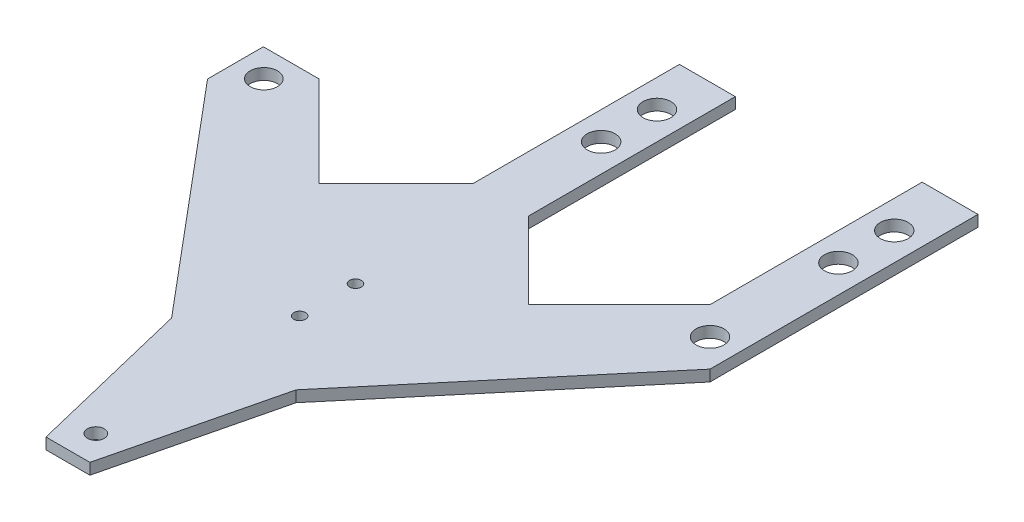
ISO-10303-21;
HEADER;
FILE_DESCRIPTION(('STEP AP214'),'2;1');
FILE_NAME('part.step','',(''),(''),'','','');
FILE_SCHEMA(('AUTOMOTIVE_DESIGN { 1 0 10303 214 1 1 1 1 }'));
ENDSEC;
DATA;
#1=APPLICATION_CONTEXT('core data for automotive mechanical design processes');
#2=APPLICATION_PROTOCOL_DEFINITION('international standard','automotive_design',2000,#1);
#3=PRODUCT_CONTEXT('',#1,'mechanical');
#4=PRODUCT('Part','Part','',(#3));
#5=PRODUCT_RELATED_PRODUCT_CATEGORY('part','',(#4));
#6=PRODUCT_DEFINITION_FORMATION('','',#4);
#7=PRODUCT_DEFINITION_CONTEXT('part definition',#1,'design');
#8=PRODUCT_DEFINITION('design','',#6,#7);
#9=PRODUCT_DEFINITION_SHAPE('','',#8);
#10=(LENGTH_UNIT() NAMED_UNIT(*) SI_UNIT(.MILLI.,.METRE.));
#11=(NAMED_UNIT(*) PLANE_ANGLE_UNIT() SI_UNIT($,.RADIAN.));
#12=(NAMED_UNIT(*) SI_UNIT($,.STERADIAN.) SOLID_ANGLE_UNIT());
#13=UNCERTAINTY_MEASURE_WITH_UNIT(LENGTH_MEASURE(1.E-05),#10,'distance_accuracy_value','');
#14=(GEOMETRIC_REPRESENTATION_CONTEXT(3) GLOBAL_UNCERTAINTY_ASSIGNED_CONTEXT((#13)) GLOBAL_UNIT_ASSIGNED_CONTEXT((#10,
#11,#12)) REPRESENTATION_CONTEXT('',''));
#15=CARTESIAN_POINT('',(0.,0.,0.));
#16=DIRECTION('',(0.,0.,1.));
#17=DIRECTION('',(1.,0.,0.));
#18=AXIS2_PLACEMENT_3D('',#15,#16,#17);
#19=CARTESIAN_POINT('',(0.,2.,0.));
#20=DIRECTION('',(0.,-1.,0.));
#21=DIRECTION('',(0.,0.,-1.));
#22=AXIS2_PLACEMENT_3D('',#19,#20,#21);
#23=PLANE('',#22);
#24=CARTESIAN_POINT('',(0.,2.,-16.5));
#25=DIRECTION('',(0.,1.,0.));
#26=DIRECTION('',(0.,0.,1.));
#27=AXIS2_PLACEMENT_3D('',#24,#25,#26);
#28=CIRCLE('',#27,1.05);
#29=CARTESIAN_POINT('',(0.,2.,-15.45));
#30=VERTEX_POINT('',#29);
#31=EDGE_CURVE('E356',#30,#30,#28,.T.);
#32=ORIENTED_EDGE('',*,*,#31,.F.);
#33=EDGE_LOOP('',(#32));
#34=FACE_BOUND('',#33,.T.);
#35=CARTESIAN_POINT('',(-0.00401466424763356,2.,-60.5));
#36=DIRECTION('',(0.,1.,0.));
#37=DIRECTION('',(0.,0.,1.));
#38=AXIS2_PLACEMENT_3D('',#35,#36,#37);
#39=CIRCLE('',#38,2.5);
#40=CARTESIAN_POINT('',(-0.00401466424763356,2.,-58.));
#41=VERTEX_POINT('',#40);
#42=EDGE_CURVE('E344',#41,#41,#39,.T.);
#43=ORIENTED_EDGE('',*,*,#42,.F.);
#44=EDGE_LOOP('',(#43));
#45=FACE_BOUND('',#44,.T.);
#46=CARTESIAN_POINT('',(40.,2.,-73.));
#47=DIRECTION('',(0.,1.,0.));
#48=DIRECTION('',(0.,0.,1.));
#49=AXIS2_PLACEMENT_3D('',#46,#47,#48);
#50=CIRCLE('',#49,2.5);
#51=CARTESIAN_POINT('',(40.,2.,-70.5));
#52=VERTEX_POINT('',#51);
#53=EDGE_CURVE('E332',#52,#52,#50,.T.);
#54=ORIENTED_EDGE('',*,*,#53,.F.);
#55=EDGE_LOOP('',(#54));
#56=FACE_BOUND('',#55,.T.);
#57=CARTESIAN_POINT('',(40.,2.,-40.));
#58=DIRECTION('',(0.,1.,0.));
#59=DIRECTION('',(0.,0.,1.));
#60=AXIS2_PLACEMENT_3D('',#57,#58,#59);
#61=CIRCLE('',#60,2.5);
#62=CARTESIAN_POINT('',(40.,2.,-37.5));
#63=VERTEX_POINT('',#62);
#64=EDGE_CURVE('E320',#63,#63,#61,.T.);
#65=ORIENTED_EDGE('',*,*,#64,.F.);
#66=EDGE_LOOP('',(#65));
#67=FACE_BOUND('',#66,.T.);
#68=DIRECTION('',(0.,0.,-1.));
#69=VECTOR('',#68,1.);
#70=CARTESIAN_POINT('',(45.,2.,-83.));
#71=LINE('',#70,#69);
#72=CARTESIAN_POINT('',(45.,2.,-35.));
#73=VERTEX_POINT('',#72);
#74=CARTESIAN_POINT('',(45.,2.,-83.));
#75=VERTEX_POINT('',#74);
#76=EDGE_CURVE('E52',#73,#75,#71,.T.);
#77=ORIENTED_EDGE('',*,*,#76,.T.);
#78=DIRECTION('',(-1.,0.,0.));
#79=VECTOR('',#78,1.);
#80=CARTESIAN_POINT('',(35.,2.,-83.));
#81=LINE('',#80,#79);
#82=CARTESIAN_POINT('',(35.,2.,-83.));
#83=VERTEX_POINT('',#82);
#84=EDGE_CURVE('E123',#75,#83,#81,.T.);
#85=ORIENTED_EDGE('',*,*,#84,.T.);
#86=DIRECTION('',(0.,0.,1.));
#87=VECTOR('',#86,1.);
#88=CARTESIAN_POINT('',(35.,2.,-45.));
#89=LINE('',#88,#87);
#90=CARTESIAN_POINT('',(35.,2.,-45.));
#91=VERTEX_POINT('',#90);
#92=EDGE_CURVE('E263',#83,#91,#89,.T.);
#93=ORIENTED_EDGE('',*,*,#92,.T.);
#94=DIRECTION('',(-0.707106781186541,0.,0.707106781186554));
#95=VECTOR('',#94,1.);
#96=CARTESIAN_POINT('',(35.,2.,-45.));
#97=LINE('',#96,#95);
#98=CARTESIAN_POINT('',(18.7500000000003,2.,-28.75));
#99=VERTEX_POINT('',#98);
#100=EDGE_CURVE('E283',#91,#99,#97,.T.);
#101=ORIENTED_EDGE('',*,*,#100,.T.);
#102=DIRECTION('',(-0.707106781186554,0.,-0.707106781186541));
#103=VECTOR('',#102,1.);
#104=CARTESIAN_POINT('',(5.,2.,-42.5));
#105=LINE('',#104,#103);
#106=CARTESIAN_POINT('',(5.,2.,-42.5));
#107=VERTEX_POINT('',#106);
#108=EDGE_CURVE('E280',#99,#107,#105,.T.);
#109=ORIENTED_EDGE('',*,*,#108,.T.);
#110=DIRECTION('',(0.,0.,-1.));
#111=VECTOR('',#110,1.);
#112=CARTESIAN_POINT('',(5.,2.,-79.5314750986378));
#113=LINE('',#112,#111);
#114=CARTESIAN_POINT('',(5.,2.,-79.5314750986378));
#115=VERTEX_POINT('',#114);
#116=EDGE_CURVE('E282',#107,#115,#113,.T.);
#117=ORIENTED_EDGE('',*,*,#116,.T.);
#118=DIRECTION('',(-1.,0.,0.));
#119=VECTOR('',#118,1.);
#120=CARTESIAN_POINT('',(-5.00401466424763,2.,-79.5314750986378));
#121=LINE('',#120,#119);
#122=CARTESIAN_POINT('',(-5.00401466424763,2.,-79.5314750986378));
#123=VERTEX_POINT('',#122);
#124=EDGE_CURVE('E285',#115,#123,#121,.T.);
#125=ORIENTED_EDGE('',*,*,#124,.T.);
#126=DIRECTION('',(0.,0.,1.));
#127=VECTOR('',#126,1.);
#128=CARTESIAN_POINT('',(-5.00401466424763,2.,-42.5));
#129=LINE('',#128,#127);
#130=CARTESIAN_POINT('',(-5.00401466424763,2.,-42.5));
#131=VERTEX_POINT('',#130);
#132=EDGE_CURVE('E291',#123,#131,#129,.T.);
#133=ORIENTED_EDGE('',*,*,#132,.T.);
#134=DIRECTION('',(-0.707003529621141,0.,0.707210017677386));
#135=VECTOR('',#134,1.);
#136=CARTESIAN_POINT('',(-18.7500000000003,2.,-28.75));
#137=LINE('',#136,#135);
#138=CARTESIAN_POINT('',(-18.7500000000003,2.,-28.75));
#139=VERTEX_POINT('',#138);
#140=EDGE_CURVE('E293',#131,#139,#137,.T.);
#141=ORIENTED_EDGE('',*,*,#140,.T.);
#142=DIRECTION('',(-0.707106781186541,0.,-0.707106781186554));
#143=VECTOR('',#142,1.);
#144=CARTESIAN_POINT('',(-35.,2.,-45.));
#145=LINE('',#144,#143);
#146=CARTESIAN_POINT('',(-35.,2.,-45.));
#147=VERTEX_POINT('',#146);
#148=EDGE_CURVE('E295',#139,#147,#145,.T.);
#149=ORIENTED_EDGE('',*,*,#148,.T.);
#150=DIRECTION('',(-1.,0.,0.));
#151=VECTOR('',#150,1.);
#152=CARTESIAN_POINT('',(-45.,2.,-45.));
#153=LINE('',#152,#151);
#154=CARTESIAN_POINT('',(-45.,2.,-45.));
#155=VERTEX_POINT('',#154);
#156=EDGE_CURVE('E297',#147,#155,#153,.T.);
#157=ORIENTED_EDGE('',*,*,#156,.T.);
#158=DIRECTION('',(0.,0.,1.));
#159=VECTOR('',#158,1.);
#160=CARTESIAN_POINT('',(-45.,2.,-45.));
#161=LINE('',#160,#159);
#162=CARTESIAN_POINT('',(-45.,2.,-35.));
#163=VERTEX_POINT('',#162);
#164=EDGE_CURVE('E299',#155,#163,#161,.T.);
#165=ORIENTED_EDGE('',*,*,#164,.T.);
#166=DIRECTION('',(0.643364883990594,0.,0.765559681571443));
#167=VECTOR('',#166,1.);
#168=CARTESIAN_POINT('',(-45.,2.,-35.));
#169=LINE('',#168,#167);
#170=CARTESIAN_POINT('',(-11.1498809278799,2.,5.27929876630725));
#171=VERTEX_POINT('',#170);
#172=EDGE_CURVE('E301',#163,#171,#169,.T.);
#173=ORIENTED_EDGE('',*,*,#172,.T.);
#174=DIRECTION('',(0.236030820361509,0.,0.971745569498247));
#175=VECTOR('',#174,1.);
#176=CARTESIAN_POINT('',(-11.1498809278799,2.,5.27929876630725));
#177=LINE('',#176,#175);
#178=CARTESIAN_POINT('',(-3.93091156583796,2.,35.));
#179=VERTEX_POINT('',#178);
#180=EDGE_CURVE('E170',#171,#179,#177,.T.);
#181=ORIENTED_EDGE('',*,*,#180,.T.);
#182=DIRECTION('',(1.,0.,0.));
#183=VECTOR('',#182,1.);
#184=CARTESIAN_POINT('',(3.93091156583796,2.,35.));
#185=LINE('',#184,#183);
#186=CARTESIAN_POINT('',(3.93091156583796,2.,35.));
#187=VERTEX_POINT('',#186);
#188=EDGE_CURVE('E164',#179,#187,#185,.T.);
#189=ORIENTED_EDGE('',*,*,#188,.T.);
#190=DIRECTION('',(0.236030820361509,0.,-0.971745569498247));
#191=VECTOR('',#190,1.);
#192=CARTESIAN_POINT('',(11.1498809278799,2.,5.27929876630725));
#193=LINE('',#192,#191);
#194=CARTESIAN_POINT('',(11.1498809278799,2.,5.27929876630725));
#195=VERTEX_POINT('',#194);
#196=EDGE_CURVE('E168',#187,#195,#193,.T.);
#197=ORIENTED_EDGE('',*,*,#196,.T.);
#198=DIRECTION('',(0.643364883990594,0.,-0.765559681571443));
#199=VECTOR('',#198,1.);
#200=CARTESIAN_POINT('',(45.,2.,-35.));
#201=LINE('',#200,#199);
#202=EDGE_CURVE('E184',#195,#73,#201,.T.);
#203=ORIENTED_EDGE('',*,*,#202,.T.);
#204=EDGE_LOOP('',(#77,#85,#93,#101,#109,#117,#125,#133,#141,#149,#157,#165,#173,#181,#189,#197,#203));
#205=FACE_BOUND('',#204,.T.);
#206=CARTESIAN_POINT('',(-39.999958797774,2.,-40.0811933154155));
#207=DIRECTION('',(0.,1.,0.));
#208=DIRECTION('',(0.,0.,1.));
#209=AXIS2_PLACEMENT_3D('',#206,#207,#208);
#210=CIRCLE('',#209,2.45281232916931);
#211=CARTESIAN_POINT('',(-39.999958797774,2.,-37.6283809862462));
#212=VERTEX_POINT('',#211);
#213=EDGE_CURVE('E193',#212,#212,#210,.T.);
#214=ORIENTED_EDGE('',*,*,#213,.F.);
#215=EDGE_LOOP('',(#214));
#216=FACE_BOUND('',#215,.T.);
#217=CARTESIAN_POINT('',(40.,2.,-63.));
#218=DIRECTION('',(0.,1.,0.));
#219=DIRECTION('',(0.,0.,1.));
#220=AXIS2_PLACEMENT_3D('',#217,#218,#219);
#221=CIRCLE('',#220,2.5);
#222=CARTESIAN_POINT('',(40.,2.,-60.5));
#223=VERTEX_POINT('',#222);
#224=EDGE_CURVE('E326',#223,#223,#221,.T.);
#225=ORIENTED_EDGE('',*,*,#224,.F.);
#226=EDGE_LOOP('',(#225));
#227=FACE_BOUND('',#226,.T.);
#228=CARTESIAN_POINT('',(0.,2.,-6.5));
#229=DIRECTION('',(0.,1.,0.));
#230=DIRECTION('',(0.,0.,1.));
#231=AXIS2_PLACEMENT_3D('',#228,#229,#230);
#232=CIRCLE('',#231,1.05);
#233=CARTESIAN_POINT('',(0.,2.,-5.45));
#234=VERTEX_POINT('',#233);
#235=EDGE_CURVE('E338',#234,#234,#232,.T.);
#236=ORIENTED_EDGE('',*,*,#235,.F.);
#237=EDGE_LOOP('',(#236));
#238=FACE_BOUND('',#237,.T.);
#239=CARTESIAN_POINT('',(0.,2.,-70.4999991941235));
#240=DIRECTION('',(0.,1.,0.));
#241=DIRECTION('',(0.,0.,1.));
#242=AXIS2_PLACEMENT_3D('',#239,#240,#241);
#243=CIRCLE('',#242,2.5);
#244=CARTESIAN_POINT('',(0.,2.,-67.9999991941235));
#245=VERTEX_POINT('',#244);
#246=EDGE_CURVE('E350',#245,#245,#243,.T.);
#247=ORIENTED_EDGE('',*,*,#246,.F.);
#248=EDGE_LOOP('',(#247));
#249=FACE_BOUND('',#248,.T.);
#250=CARTESIAN_POINT('',(0.,2.,30.));
#251=DIRECTION('',(0.,1.,0.));
#252=DIRECTION('',(0.,0.,1.));
#253=AXIS2_PLACEMENT_3D('',#250,#251,#252);
#254=CIRCLE('',#253,1.5);
#255=CARTESIAN_POINT('',(0.,2.,31.5));
#256=VERTEX_POINT('',#255);
#257=EDGE_CURVE('E362',#256,#256,#254,.T.);
#258=ORIENTED_EDGE('',*,*,#257,.F.);
#259=EDGE_LOOP('',(#258));
#260=FACE_BOUND('',#259,.T.);
#261=ADVANCED_FACE('F35',(#34,#45,#56,#67,#205,#216,#227,#238,#249,#260),#23,.F.);
#262=CARTESIAN_POINT('',(0.,0.,0.));
#263=DIRECTION('',(0.,-1.,0.));
#264=DIRECTION('',(0.,0.,-1.));
#265=AXIS2_PLACEMENT_3D('',#262,#263,#264);
#266=PLANE('',#265);
#267=CARTESIAN_POINT('',(0.,0.,-16.5));
#268=DIRECTION('',(0.,1.,0.));
#269=DIRECTION('',(0.,0.,1.));
#270=AXIS2_PLACEMENT_3D('',#267,#268,#269);
#271=CIRCLE('',#270,1.05);
#272=CARTESIAN_POINT('',(0.,0.,-15.45));
#273=VERTEX_POINT('',#272);
#274=EDGE_CURVE('E359',#273,#273,#271,.T.);
#275=ORIENTED_EDGE('',*,*,#274,.T.);
#276=EDGE_LOOP('',(#275));
#277=FACE_BOUND('',#276,.T.);
#278=CARTESIAN_POINT('',(-0.00401466424763356,0.,-60.5));
#279=DIRECTION('',(0.,1.,0.));
#280=DIRECTION('',(0.,0.,1.));
#281=AXIS2_PLACEMENT_3D('',#278,#279,#280);
#282=CIRCLE('',#281,2.5);
#283=CARTESIAN_POINT('',(-0.00401466424763356,0.,-58.));
#284=VERTEX_POINT('',#283);
#285=EDGE_CURVE('E347',#284,#284,#282,.T.);
#286=ORIENTED_EDGE('',*,*,#285,.T.);
#287=EDGE_LOOP('',(#286));
#288=FACE_BOUND('',#287,.T.);
#289=CARTESIAN_POINT('',(40.,0.,-73.));
#290=DIRECTION('',(0.,1.,0.));
#291=DIRECTION('',(0.,0.,1.));
#292=AXIS2_PLACEMENT_3D('',#289,#290,#291);
#293=CIRCLE('',#292,2.5);
#294=CARTESIAN_POINT('',(40.,0.,-70.5));
#295=VERTEX_POINT('',#294);
#296=EDGE_CURVE('E335',#295,#295,#293,.T.);
#297=ORIENTED_EDGE('',*,*,#296,.T.);
#298=EDGE_LOOP('',(#297));
#299=FACE_BOUND('',#298,.T.);
#300=CARTESIAN_POINT('',(40.,0.,-40.));
#301=DIRECTION('',(0.,1.,0.));
#302=DIRECTION('',(0.,0.,1.));
#303=AXIS2_PLACEMENT_3D('',#300,#301,#302);
#304=CIRCLE('',#303,2.5);
#305=CARTESIAN_POINT('',(40.,0.,-37.5));
#306=VERTEX_POINT('',#305);
#307=EDGE_CURVE('E323',#306,#306,#304,.T.);
#308=ORIENTED_EDGE('',*,*,#307,.T.);
#309=EDGE_LOOP('',(#308));
#310=FACE_BOUND('',#309,.T.);
#311=DIRECTION('',(-1.,0.,0.));
#312=VECTOR('',#311,1.);
#313=CARTESIAN_POINT('',(35.,0.,-83.));
#314=LINE('',#313,#312);
#315=CARTESIAN_POINT('',(45.,0.,-83.));
#316=VERTEX_POINT('',#315);
#317=CARTESIAN_POINT('',(35.,0.,-83.));
#318=VERTEX_POINT('',#317);
#319=EDGE_CURVE('E190',#316,#318,#314,.T.);
#320=ORIENTED_EDGE('',*,*,#319,.F.);
#321=DIRECTION('',(0.,0.,-1.));
#322=VECTOR('',#321,1.);
#323=CARTESIAN_POINT('',(45.,0.,-45.));
#324=LINE('',#323,#322);
#325=CARTESIAN_POINT('',(45.,0.,-35.));
#326=VERTEX_POINT('',#325);
#327=EDGE_CURVE('E220',#326,#316,#324,.T.);
#328=ORIENTED_EDGE('',*,*,#327,.F.);
#329=DIRECTION('',(0.643364883990594,0.,-0.765559681571443));
#330=VECTOR('',#329,1.);
#331=CARTESIAN_POINT('',(45.,0.,-35.));
#332=LINE('',#331,#330);
#333=CARTESIAN_POINT('',(11.1498809278799,0.,5.27929876630725));
#334=VERTEX_POINT('',#333);
#335=EDGE_CURVE('E116',#334,#326,#332,.T.);
#336=ORIENTED_EDGE('',*,*,#335,.F.);
#337=DIRECTION('',(0.236030820361509,0.,-0.971745569498247));
#338=VECTOR('',#337,1.);
#339=CARTESIAN_POINT('',(11.1498809278799,0.,5.27929876630725));
#340=LINE('',#339,#338);
#341=CARTESIAN_POINT('',(3.93091156583796,0.,35.));
#342=VERTEX_POINT('',#341);
#343=EDGE_CURVE('E109',#342,#334,#340,.T.);
#344=ORIENTED_EDGE('',*,*,#343,.F.);
#345=DIRECTION('',(1.,0.,0.));
#346=VECTOR('',#345,1.);
#347=CARTESIAN_POINT('',(3.93091156583796,0.,35.));
#348=LINE('',#347,#346);
#349=CARTESIAN_POINT('',(-3.93091156583796,0.,35.));
#350=VERTEX_POINT('',#349);
#351=EDGE_CURVE('E178',#350,#342,#348,.T.);
#352=ORIENTED_EDGE('',*,*,#351,.F.);
#353=DIRECTION('',(0.236030820361509,0.,0.971745569498247));
#354=VECTOR('',#353,1.);
#355=CARTESIAN_POINT('',(-11.1498809278799,0.,5.27929876630725));
#356=LINE('',#355,#354);
#357=CARTESIAN_POINT('',(-11.1498809278799,0.,5.27929876630725));
#358=VERTEX_POINT('',#357);
#359=EDGE_CURVE('E215',#358,#350,#356,.T.);
#360=ORIENTED_EDGE('',*,*,#359,.F.);
#361=DIRECTION('',(0.643364883990594,0.,0.765559681571443));
#362=VECTOR('',#361,1.);
#363=CARTESIAN_POINT('',(-45.,0.,-35.));
#364=LINE('',#363,#362);
#365=CARTESIAN_POINT('',(-45.,0.,-35.));
#366=VERTEX_POINT('',#365);
#367=EDGE_CURVE('E213',#366,#358,#364,.T.);
#368=ORIENTED_EDGE('',*,*,#367,.F.);
#369=DIRECTION('',(0.,0.,1.));
#370=VECTOR('',#369,1.);
#371=CARTESIAN_POINT('',(-45.,0.,-45.));
#372=LINE('',#371,#370);
#373=CARTESIAN_POINT('',(-45.,0.,-45.));
#374=VERTEX_POINT('',#373);
#375=EDGE_CURVE('E211',#374,#366,#372,.T.);
#376=ORIENTED_EDGE('',*,*,#375,.F.);
#377=DIRECTION('',(-1.,0.,0.));
#378=VECTOR('',#377,1.);
#379=CARTESIAN_POINT('',(-45.,0.,-45.));
#380=LINE('',#379,#378);
#381=CARTESIAN_POINT('',(-35.,0.,-45.));
#382=VERTEX_POINT('',#381);
#383=EDGE_CURVE('E209',#382,#374,#380,.T.);
#384=ORIENTED_EDGE('',*,*,#383,.F.);
#385=DIRECTION('',(-0.707106781186541,0.,-0.707106781186554));
#386=VECTOR('',#385,1.);
#387=CARTESIAN_POINT('',(-35.,0.,-45.));
#388=LINE('',#387,#386);
#389=CARTESIAN_POINT('',(-18.7500000000003,0.,-28.75));
#390=VERTEX_POINT('',#389);
#391=EDGE_CURVE('E207',#390,#382,#388,.T.);
#392=ORIENTED_EDGE('',*,*,#391,.F.);
#393=DIRECTION('',(-0.707003529621141,0.,0.707210017677386));
#394=VECTOR('',#393,1.);
#395=CARTESIAN_POINT('',(-18.7500000000003,0.,-28.75));
#396=LINE('',#395,#394);
#397=CARTESIAN_POINT('',(-5.00401466424763,0.,-42.5));
#398=VERTEX_POINT('',#397);
#399=EDGE_CURVE('E205',#398,#390,#396,.T.);
#400=ORIENTED_EDGE('',*,*,#399,.F.);
#401=DIRECTION('',(0.,0.,1.));
#402=VECTOR('',#401,1.);
#403=CARTESIAN_POINT('',(-5.00401466424763,0.,-42.5));
#404=LINE('',#403,#402);
#405=CARTESIAN_POINT('',(-5.00401466424763,0.,-79.5314750986378));
#406=VERTEX_POINT('',#405);
#407=EDGE_CURVE('E203',#406,#398,#404,.T.);
#408=ORIENTED_EDGE('',*,*,#407,.F.);
#409=DIRECTION('',(-1.,0.,0.));
#410=VECTOR('',#409,1.);
#411=CARTESIAN_POINT('',(-5.00401466424763,0.,-79.5314750986378));
#412=LINE('',#411,#410);
#413=CARTESIAN_POINT('',(5.,0.,-79.5314750986378));
#414=VERTEX_POINT('',#413);
#415=EDGE_CURVE('E201',#414,#406,#412,.T.);
#416=ORIENTED_EDGE('',*,*,#415,.F.);
#417=DIRECTION('',(0.,0.,-1.));
#418=VECTOR('',#417,1.);
#419=CARTESIAN_POINT('',(5.,0.,-79.5314750986378));
#420=LINE('',#419,#418);
#421=CARTESIAN_POINT('',(5.,0.,-42.5));
#422=VERTEX_POINT('',#421);
#423=EDGE_CURVE('E199',#422,#414,#420,.T.);
#424=ORIENTED_EDGE('',*,*,#423,.F.);
#425=DIRECTION('',(-0.707106781186554,0.,-0.707106781186541));
#426=VECTOR('',#425,1.);
#427=CARTESIAN_POINT('',(5.,0.,-42.5));
#428=LINE('',#427,#426);
#429=CARTESIAN_POINT('',(18.7500000000003,0.,-28.75));
#430=VERTEX_POINT('',#429);
#431=EDGE_CURVE('E197',#430,#422,#428,.T.);
#432=ORIENTED_EDGE('',*,*,#431,.F.);
#433=DIRECTION('',(-0.707106781186541,0.,0.707106781186554));
#434=VECTOR('',#433,1.);
#435=CARTESIAN_POINT('',(35.,0.,-45.));
#436=LINE('',#435,#434);
#437=CARTESIAN_POINT('',(35.,0.,-45.));
#438=VERTEX_POINT('',#437);
#439=EDGE_CURVE('E195',#438,#430,#436,.T.);
#440=ORIENTED_EDGE('',*,*,#439,.F.);
#441=DIRECTION('',(0.,0.,1.));
#442=VECTOR('',#441,1.);
#443=CARTESIAN_POINT('',(35.,0.,-45.));
#444=LINE('',#443,#442);
#445=EDGE_CURVE('E192',#318,#438,#444,.T.);
#446=ORIENTED_EDGE('',*,*,#445,.F.);
#447=EDGE_LOOP('',(#320,#328,#336,#344,#352,#360,#368,#376,#384,#392,#400,#408,#416,#424,#432,
#440,#446));
#448=FACE_BOUND('',#447,.T.);
#449=CARTESIAN_POINT('',(-39.999958797774,0.,-40.0811933154155));
#450=DIRECTION('',(0.,1.,0.));
#451=DIRECTION('',(0.,0.,1.));
#452=AXIS2_PLACEMENT_3D('',#449,#450,#451);
#453=CIRCLE('',#452,2.45281232916931);
#454=CARTESIAN_POINT('',(-39.999958797774,0.,-37.6283809862462));
#455=VERTEX_POINT('',#454);
#456=EDGE_CURVE('E317',#455,#455,#453,.T.);
#457=ORIENTED_EDGE('',*,*,#456,.T.);
#458=EDGE_LOOP('',(#457));
#459=FACE_BOUND('',#458,.T.);
#460=CARTESIAN_POINT('',(40.,0.,-63.));
#461=DIRECTION('',(0.,1.,0.));
#462=DIRECTION('',(0.,0.,1.));
#463=AXIS2_PLACEMENT_3D('',#460,#461,#462);
#464=CIRCLE('',#463,2.5);
#465=CARTESIAN_POINT('',(40.,0.,-60.5));
#466=VERTEX_POINT('',#465);
#467=EDGE_CURVE('E329',#466,#466,#464,.T.);
#468=ORIENTED_EDGE('',*,*,#467,.T.);
#469=EDGE_LOOP('',(#468));
#470=FACE_BOUND('',#469,.T.);
#471=CARTESIAN_POINT('',(0.,0.,-6.5));
#472=DIRECTION('',(0.,1.,0.));
#473=DIRECTION('',(0.,0.,1.));
#474=AXIS2_PLACEMENT_3D('',#471,#472,#473);
#475=CIRCLE('',#474,1.05);
#476=CARTESIAN_POINT('',(0.,0.,-5.45));
#477=VERTEX_POINT('',#476);
#478=EDGE_CURVE('E341',#477,#477,#475,.T.);
#479=ORIENTED_EDGE('',*,*,#478,.T.);
#480=EDGE_LOOP('',(#479));
#481=FACE_BOUND('',#480,.T.);
#482=CARTESIAN_POINT('',(0.,0.,-70.4999991941235));
#483=DIRECTION('',(0.,1.,0.));
#484=DIRECTION('',(0.,0.,1.));
#485=AXIS2_PLACEMENT_3D('',#482,#483,#484);
#486=CIRCLE('',#485,2.5);
#487=CARTESIAN_POINT('',(0.,0.,-67.9999991941235));
#488=VERTEX_POINT('',#487);
#489=EDGE_CURVE('E353',#488,#488,#486,.T.);
#490=ORIENTED_EDGE('',*,*,#489,.T.);
#491=EDGE_LOOP('',(#490));
#492=FACE_BOUND('',#491,.T.);
#493=CARTESIAN_POINT('',(0.,0.,30.));
#494=DIRECTION('',(0.,1.,0.));
#495=DIRECTION('',(0.,0.,1.));
#496=AXIS2_PLACEMENT_3D('',#493,#494,#495);
#497=CIRCLE('',#496,1.5);
#498=CARTESIAN_POINT('',(0.,0.,31.5));
#499=VERTEX_POINT('',#498);
#500=EDGE_CURVE('E365',#499,#499,#497,.T.);
#501=ORIENTED_EDGE('',*,*,#500,.T.);
#502=EDGE_LOOP('',(#501));
#503=FACE_BOUND('',#502,.T.);
#504=ADVANCED_FACE('F267',(#277,#288,#299,#310,#448,#459,#470,#481,#492,#503),#266,.T.);
#505=CARTESIAN_POINT('',(35.,2.,-83.));
#506=DIRECTION('',(0.,0.,1.));
#507=DIRECTION('',(1.,0.,0.));
#508=AXIS2_PLACEMENT_3D('',#505,#506,#507);
#509=PLANE('',#508);
#510=ORIENTED_EDGE('',*,*,#319,.T.);
#511=DIRECTION('',(0.,-1.,0.));
#512=VECTOR('',#511,1.);
#513=CARTESIAN_POINT('',(35.,2.,-83.));
#514=LINE('',#513,#512);
#515=EDGE_CURVE('E44',#83,#318,#514,.T.);
#516=ORIENTED_EDGE('',*,*,#515,.F.);
#517=ORIENTED_EDGE('',*,*,#84,.F.);
#518=DIRECTION('',(0.,-1.,0.));
#519=VECTOR('',#518,1.);
#520=CARTESIAN_POINT('',(45.,2.,-83.));
#521=LINE('',#520,#519);
#522=EDGE_CURVE('E11',#75,#316,#521,.T.);
#523=ORIENTED_EDGE('',*,*,#522,.T.);
#524=EDGE_LOOP('',(#510,#516,#517,#523));
#525=FACE_BOUND('',#524,.T.);
#526=ADVANCED_FACE('F37',(#525),#509,.F.);
#527=CARTESIAN_POINT('',(35.,2.,-45.));
#528=DIRECTION('',(1.,0.,0.));
#529=DIRECTION('',(0.,0.,-1.));
#530=AXIS2_PLACEMENT_3D('',#527,#528,#529);
#531=PLANE('',#530);
#532=ORIENTED_EDGE('',*,*,#445,.T.);
#533=DIRECTION('',(0.,-1.,0.));
#534=VECTOR('',#533,1.);
#535=CARTESIAN_POINT('',(35.,2.,-45.));
#536=LINE('',#535,#534);
#537=EDGE_CURVE('E255',#91,#438,#536,.T.);
#538=ORIENTED_EDGE('',*,*,#537,.F.);
#539=ORIENTED_EDGE('',*,*,#92,.F.);
#540=ORIENTED_EDGE('',*,*,#515,.T.);
#541=EDGE_LOOP('',(#532,#538,#539,#540));
#542=FACE_BOUND('',#541,.T.);
#543=ADVANCED_FACE('F261',(#542),#531,.F.);
#544=CARTESIAN_POINT('',(35.,2.,-45.));
#545=DIRECTION('',(0.707106781186554,0.,0.707106781186541));
#546=DIRECTION('',(0.707106781186541,0.,-0.707106781186554));
#547=AXIS2_PLACEMENT_3D('',#544,#545,#546);
#548=PLANE('',#547);
#549=ORIENTED_EDGE('',*,*,#439,.T.);
#550=DIRECTION('',(0.,-1.,0.));
#551=VECTOR('',#550,1.);
#552=CARTESIAN_POINT('',(18.7500000000003,2.,-28.75));
#553=LINE('',#552,#551);
#554=EDGE_CURVE('E252',#99,#430,#553,.T.);
#555=ORIENTED_EDGE('',*,*,#554,.F.);
#556=ORIENTED_EDGE('',*,*,#100,.F.);
#557=ORIENTED_EDGE('',*,*,#537,.T.);
#558=EDGE_LOOP('',(#549,#555,#556,#557));
#559=FACE_BOUND('',#558,.T.);
#560=ADVANCED_FACE('F274',(#559),#548,.F.);
#561=CARTESIAN_POINT('',(5.,2.,-42.5));
#562=DIRECTION('',(-0.707106781186541,0.,0.707106781186554));
#563=DIRECTION('',(0.707106781186554,0.,0.707106781186541));
#564=AXIS2_PLACEMENT_3D('',#561,#562,#563);
#565=PLANE('',#564);
#566=ORIENTED_EDGE('',*,*,#431,.T.);
#567=DIRECTION('',(0.,-1.,0.));
#568=VECTOR('',#567,1.);
#569=CARTESIAN_POINT('',(5.,2.,-42.5));
#570=LINE('',#569,#568);
#571=EDGE_CURVE('E249',#107,#422,#570,.T.);
#572=ORIENTED_EDGE('',*,*,#571,.F.);
#573=ORIENTED_EDGE('',*,*,#108,.F.);
#574=ORIENTED_EDGE('',*,*,#554,.T.);
#575=EDGE_LOOP('',(#566,#572,#573,#574));
#576=FACE_BOUND('',#575,.T.);
#577=ADVANCED_FACE('F278',(#576),#565,.F.);
#578=CARTESIAN_POINT('',(5.,2.,-79.5314750986378));
#579=DIRECTION('',(-1.,0.,0.));
#580=DIRECTION('',(0.,0.,1.));
#581=AXIS2_PLACEMENT_3D('',#578,#579,#580);
#582=PLANE('',#581);
#583=ORIENTED_EDGE('',*,*,#423,.T.);
#584=DIRECTION('',(0.,-1.,0.));
#585=VECTOR('',#584,1.);
#586=CARTESIAN_POINT('',(5.,2.,-79.5314750986378));
#587=LINE('',#586,#585);
#588=EDGE_CURVE('E246',#115,#414,#587,.T.);
#589=ORIENTED_EDGE('',*,*,#588,.F.);
#590=ORIENTED_EDGE('',*,*,#116,.F.);
#591=ORIENTED_EDGE('',*,*,#571,.T.);
#592=EDGE_LOOP('',(#583,#589,#590,#591));
#593=FACE_BOUND('',#592,.T.);
#594=ADVANCED_FACE('F423',(#593),#582,.F.);
#595=CARTESIAN_POINT('',(-5.00401466424763,2.,-79.5314750986378));
#596=DIRECTION('',(0.,0.,1.));
#597=DIRECTION('',(1.,0.,0.));
#598=AXIS2_PLACEMENT_3D('',#595,#596,#597);
#599=PLANE('',#598);
#600=ORIENTED_EDGE('',*,*,#415,.T.);
#601=DIRECTION('',(0.,-1.,0.));
#602=VECTOR('',#601,1.);
#603=CARTESIAN_POINT('',(-5.00401466424763,2.,-79.5314750986378));
#604=LINE('',#603,#602);
#605=EDGE_CURVE('E243',#123,#406,#604,.T.);
#606=ORIENTED_EDGE('',*,*,#605,.F.);
#607=ORIENTED_EDGE('',*,*,#124,.F.);
#608=ORIENTED_EDGE('',*,*,#588,.T.);
#609=EDGE_LOOP('',(#600,#606,#607,#608));
#610=FACE_BOUND('',#609,.T.);
#611=ADVANCED_FACE('F419',(#610),#599,.F.);
#612=CARTESIAN_POINT('',(-5.00401466424763,2.,-42.5));
#613=DIRECTION('',(1.,0.,0.));
#614=DIRECTION('',(0.,0.,-1.));
#615=AXIS2_PLACEMENT_3D('',#612,#613,#614);
#616=PLANE('',#615);
#617=ORIENTED_EDGE('',*,*,#407,.T.);
#618=DIRECTION('',(0.,-1.,0.));
#619=VECTOR('',#618,1.);
#620=CARTESIAN_POINT('',(-5.00401466424763,2.,-42.5));
#621=LINE('',#620,#619);
#622=EDGE_CURVE('E240',#131,#398,#621,.T.);
#623=ORIENTED_EDGE('',*,*,#622,.F.);
#624=ORIENTED_EDGE('',*,*,#132,.F.);
#625=ORIENTED_EDGE('',*,*,#605,.T.);
#626=EDGE_LOOP('',(#617,#623,#624,#625));
#627=FACE_BOUND('',#626,.T.);
#628=ADVANCED_FACE('F415',(#627),#616,.F.);
#629=CARTESIAN_POINT('',(-18.7500000000003,2.,-28.75));
#630=DIRECTION('',(0.707210017677386,0.,0.707003529621141));
#631=DIRECTION('',(0.707003529621141,0.,-0.707210017677386));
#632=AXIS2_PLACEMENT_3D('',#629,#630,#631);
#633=PLANE('',#632);
#634=ORIENTED_EDGE('',*,*,#399,.T.);
#635=DIRECTION('',(0.,-1.,0.));
#636=VECTOR('',#635,1.);
#637=CARTESIAN_POINT('',(-18.7500000000003,2.,-28.75));
#638=LINE('',#637,#636);
#639=EDGE_CURVE('E237',#139,#390,#638,.T.);
#640=ORIENTED_EDGE('',*,*,#639,.F.);
#641=ORIENTED_EDGE('',*,*,#140,.F.);
#642=ORIENTED_EDGE('',*,*,#622,.T.);
#643=EDGE_LOOP('',(#634,#640,#641,#642));
#644=FACE_BOUND('',#643,.T.);
#645=ADVANCED_FACE('F411',(#644),#633,.F.);
#646=CARTESIAN_POINT('',(-35.,2.,-45.));
#647=DIRECTION('',(-0.707106781186554,0.,0.707106781186541));
#648=DIRECTION('',(0.707106781186541,0.,0.707106781186554));
#649=AXIS2_PLACEMENT_3D('',#646,#647,#648);
#650=PLANE('',#649);
#651=ORIENTED_EDGE('',*,*,#391,.T.);
#652=DIRECTION('',(0.,-1.,0.));
#653=VECTOR('',#652,1.);
#654=CARTESIAN_POINT('',(-35.,2.,-45.));
#655=LINE('',#654,#653);
#656=EDGE_CURVE('E234',#147,#382,#655,.T.);
#657=ORIENTED_EDGE('',*,*,#656,.F.);
#658=ORIENTED_EDGE('',*,*,#148,.F.);
#659=ORIENTED_EDGE('',*,*,#639,.T.);
#660=EDGE_LOOP('',(#651,#657,#658,#659));
#661=FACE_BOUND('',#660,.T.);
#662=ADVANCED_FACE('F407',(#661),#650,.F.);
#663=CARTESIAN_POINT('',(-45.,2.,-45.));
#664=DIRECTION('',(0.,0.,1.));
#665=DIRECTION('',(1.,0.,0.));
#666=AXIS2_PLACEMENT_3D('',#663,#664,#665);
#667=PLANE('',#666);
#668=ORIENTED_EDGE('',*,*,#383,.T.);
#669=DIRECTION('',(0.,-1.,0.));
#670=VECTOR('',#669,1.);
#671=CARTESIAN_POINT('',(-45.,2.,-45.));
#672=LINE('',#671,#670);
#673=EDGE_CURVE('E231',#155,#374,#672,.T.);
#674=ORIENTED_EDGE('',*,*,#673,.F.);
#675=ORIENTED_EDGE('',*,*,#156,.F.);
#676=ORIENTED_EDGE('',*,*,#656,.T.);
#677=EDGE_LOOP('',(#668,#674,#675,#676));
#678=FACE_BOUND('',#677,.T.);
#679=ADVANCED_FACE('F403',(#678),#667,.F.);
#680=CARTESIAN_POINT('',(-45.,2.,-45.));
#681=DIRECTION('',(1.,0.,0.));
#682=DIRECTION('',(0.,0.,-1.));
#683=AXIS2_PLACEMENT_3D('',#680,#681,#682);
#684=PLANE('',#683);
#685=ORIENTED_EDGE('',*,*,#375,.T.);
#686=DIRECTION('',(0.,-1.,0.));
#687=VECTOR('',#686,1.);
#688=CARTESIAN_POINT('',(-45.,2.,-35.));
#689=LINE('',#688,#687);
#690=EDGE_CURVE('E228',#163,#366,#689,.T.);
#691=ORIENTED_EDGE('',*,*,#690,.F.);
#692=ORIENTED_EDGE('',*,*,#164,.F.);
#693=ORIENTED_EDGE('',*,*,#673,.T.);
#694=EDGE_LOOP('',(#685,#691,#692,#693));
#695=FACE_BOUND('',#694,.T.);
#696=ADVANCED_FACE('F400',(#695),#684,.F.);
#697=CARTESIAN_POINT('',(-45.,2.,-35.));
#698=DIRECTION('',(0.765559681571443,0.,-0.643364883990594));
#699=DIRECTION('',(-0.643364883990594,0.,-0.765559681571443));
#700=AXIS2_PLACEMENT_3D('',#697,#698,#699);
#701=PLANE('',#700);
#702=ORIENTED_EDGE('',*,*,#367,.T.);
#703=DIRECTION('',(0.,-1.,0.));
#704=VECTOR('',#703,1.);
#705=CARTESIAN_POINT('',(-11.1498809278799,2.,5.27929876630725));
#706=LINE('',#705,#704);
#707=EDGE_CURVE('E225',#171,#358,#706,.T.);
#708=ORIENTED_EDGE('',*,*,#707,.F.);
#709=ORIENTED_EDGE('',*,*,#172,.F.);
#710=ORIENTED_EDGE('',*,*,#690,.T.);
#711=EDGE_LOOP('',(#702,#708,#709,#710));
#712=FACE_BOUND('',#711,.T.);
#713=ADVANCED_FACE('F307',(#712),#701,.F.);
#714=CARTESIAN_POINT('',(-11.1498809278799,2.,5.27929876630725));
#715=DIRECTION('',(0.971745569498247,0.,-0.236030820361509));
#716=DIRECTION('',(-0.236030820361509,0.,-0.971745569498247));
#717=AXIS2_PLACEMENT_3D('',#714,#715,#716);
#718=PLANE('',#717);
#719=ORIENTED_EDGE('',*,*,#359,.T.);
#720=DIRECTION('',(0.,-1.,0.));
#721=VECTOR('',#720,1.);
#722=CARTESIAN_POINT('',(-3.93091156583796,2.,35.));
#723=LINE('',#722,#721);
#724=EDGE_CURVE('E179',#179,#350,#723,.T.);
#725=ORIENTED_EDGE('',*,*,#724,.F.);
#726=ORIENTED_EDGE('',*,*,#180,.F.);
#727=ORIENTED_EDGE('',*,*,#707,.T.);
#728=EDGE_LOOP('',(#719,#725,#726,#727));
#729=FACE_BOUND('',#728,.T.);
#730=ADVANCED_FACE('F311',(#729),#718,.F.);
#731=CARTESIAN_POINT('',(3.93091156583796,2.,35.));
#732=DIRECTION('',(0.,0.,-1.));
#733=DIRECTION('',(-1.,0.,0.));
#734=AXIS2_PLACEMENT_3D('',#731,#732,#733);
#735=PLANE('',#734);
#736=ORIENTED_EDGE('',*,*,#351,.T.);
#737=DIRECTION('',(0.,-1.,0.));
#738=VECTOR('',#737,1.);
#739=CARTESIAN_POINT('',(3.93091156583796,2.,35.));
#740=LINE('',#739,#738);
#741=EDGE_CURVE('E175',#187,#342,#740,.T.);
#742=ORIENTED_EDGE('',*,*,#741,.F.);
#743=ORIENTED_EDGE('',*,*,#188,.F.);
#744=ORIENTED_EDGE('',*,*,#724,.T.);
#745=EDGE_LOOP('',(#736,#742,#743,#744));
#746=FACE_BOUND('',#745,.T.);
#747=ADVANCED_FACE('F176',(#746),#735,.F.);
#748=CARTESIAN_POINT('',(11.1498809278799,2.,5.27929876630725));
#749=DIRECTION('',(-0.971745569498247,0.,-0.236030820361509));
#750=DIRECTION('',(-0.236030820361509,0.,0.971745569498247));
#751=AXIS2_PLACEMENT_3D('',#748,#749,#750);
#752=PLANE('',#751);
#753=ORIENTED_EDGE('',*,*,#343,.T.);
#754=DIRECTION('',(0.,-1.,0.));
#755=VECTOR('',#754,1.);
#756=CARTESIAN_POINT('',(11.1498809278799,2.,5.27929876630725));
#757=LINE('',#756,#755);
#758=EDGE_CURVE('E180',#195,#334,#757,.T.);
#759=ORIENTED_EDGE('',*,*,#758,.F.);
#760=ORIENTED_EDGE('',*,*,#196,.F.);
#761=ORIENTED_EDGE('',*,*,#741,.T.);
#762=EDGE_LOOP('',(#753,#759,#760,#761));
#763=FACE_BOUND('',#762,.T.);
#764=ADVANCED_FACE('F182',(#763),#752,.F.);
#765=CARTESIAN_POINT('',(45.,2.,-35.));
#766=DIRECTION('',(-0.765559681571443,0.,-0.643364883990594));
#767=DIRECTION('',(-0.643364883990594,0.,0.765559681571443));
#768=AXIS2_PLACEMENT_3D('',#765,#766,#767);
#769=PLANE('',#768);
#770=ORIENTED_EDGE('',*,*,#335,.T.);
#771=DIRECTION('',(0.,-1.,0.));
#772=VECTOR('',#771,1.);
#773=CARTESIAN_POINT('',(45.,2.,-35.));
#774=LINE('',#773,#772);
#775=EDGE_CURVE('E186',#73,#326,#774,.T.);
#776=ORIENTED_EDGE('',*,*,#775,.F.);
#777=ORIENTED_EDGE('',*,*,#202,.F.);
#778=ORIENTED_EDGE('',*,*,#758,.T.);
#779=EDGE_LOOP('',(#770,#776,#777,#778));
#780=FACE_BOUND('',#779,.T.);
#781=ADVANCED_FACE('F313',(#780),#769,.F.);
#782=CARTESIAN_POINT('',(45.,2.,-45.));
#783=DIRECTION('',(-1.,0.,0.));
#784=DIRECTION('',(0.,0.,1.));
#785=AXIS2_PLACEMENT_3D('',#782,#783,#784);
#786=PLANE('',#785);
#787=ORIENTED_EDGE('',*,*,#327,.T.);
#788=ORIENTED_EDGE('',*,*,#522,.F.);
#789=ORIENTED_EDGE('',*,*,#76,.F.);
#790=ORIENTED_EDGE('',*,*,#775,.T.);
#791=EDGE_LOOP('',(#787,#788,#789,#790));
#792=FACE_BOUND('',#791,.T.);
#793=ADVANCED_FACE('F312',(#792),#786,.F.);
#794=CARTESIAN_POINT('',(-39.999958797774,2.,-40.0811933154155));
#795=DIRECTION('',(0.,-1.,0.));
#796=DIRECTION('',(0.,0.,-1.));
#797=AXIS2_PLACEMENT_3D('',#794,#795,#796);
#798=CYLINDRICAL_SURFACE('',#797,2.45281232916931);
#799=ORIENTED_EDGE('',*,*,#213,.T.);
#800=EDGE_LOOP('',(#799));
#801=FACE_BOUND('',#800,.T.);
#802=ORIENTED_EDGE('',*,*,#456,.F.);
#803=EDGE_LOOP('',(#802));
#804=FACE_BOUND('',#803,.T.);
#805=ADVANCED_FACE('F385',(#801,#804),#798,.F.);
#806=CARTESIAN_POINT('',(40.,2.,-40.));
#807=DIRECTION('',(0.,-1.,0.));
#808=DIRECTION('',(0.,0.,-1.));
#809=AXIS2_PLACEMENT_3D('',#806,#807,#808);
#810=CYLINDRICAL_SURFACE('',#809,2.5);
#811=ORIENTED_EDGE('',*,*,#64,.T.);
#812=EDGE_LOOP('',(#811));
#813=FACE_BOUND('',#812,.T.);
#814=ORIENTED_EDGE('',*,*,#307,.F.);
#815=EDGE_LOOP('',(#814));
#816=FACE_BOUND('',#815,.T.);
#817=ADVANCED_FACE('F539',(#813,#816),#810,.F.);
#818=CARTESIAN_POINT('',(40.,2.,-63.));
#819=DIRECTION('',(0.,-1.,0.));
#820=DIRECTION('',(0.,0.,-1.));
#821=AXIS2_PLACEMENT_3D('',#818,#819,#820);
#822=CYLINDRICAL_SURFACE('',#821,2.5);
#823=ORIENTED_EDGE('',*,*,#224,.T.);
#824=EDGE_LOOP('',(#823));
#825=FACE_BOUND('',#824,.T.);
#826=ORIENTED_EDGE('',*,*,#467,.F.);
#827=EDGE_LOOP('',(#826));
#828=FACE_BOUND('',#827,.T.);
#829=ADVANCED_FACE('F547',(#825,#828),#822,.F.);
#830=CARTESIAN_POINT('',(40.,2.,-73.));
#831=DIRECTION('',(0.,-1.,0.));
#832=DIRECTION('',(0.,0.,-1.));
#833=AXIS2_PLACEMENT_3D('',#830,#831,#832);
#834=CYLINDRICAL_SURFACE('',#833,2.5);
#835=ORIENTED_EDGE('',*,*,#53,.T.);
#836=EDGE_LOOP('',(#835));
#837=FACE_BOUND('',#836,.T.);
#838=ORIENTED_EDGE('',*,*,#296,.F.);
#839=EDGE_LOOP('',(#838));
#840=FACE_BOUND('',#839,.T.);
#841=ADVANCED_FACE('F555',(#837,#840),#834,.F.);
#842=CARTESIAN_POINT('',(0.,2.,-6.5));
#843=DIRECTION('',(0.,-1.,0.));
#844=DIRECTION('',(0.,0.,-1.));
#845=AXIS2_PLACEMENT_3D('',#842,#843,#844);
#846=CYLINDRICAL_SURFACE('',#845,1.05);
#847=ORIENTED_EDGE('',*,*,#235,.T.);
#848=EDGE_LOOP('',(#847));
#849=FACE_BOUND('',#848,.T.);
#850=ORIENTED_EDGE('',*,*,#478,.F.);
#851=EDGE_LOOP('',(#850));
#852=FACE_BOUND('',#851,.T.);
#853=ADVANCED_FACE('F564',(#849,#852),#846,.F.);
#854=CARTESIAN_POINT('',(-0.00401466424763356,2.,-60.5));
#855=DIRECTION('',(0.,-1.,0.));
#856=DIRECTION('',(0.,0.,-1.));
#857=AXIS2_PLACEMENT_3D('',#854,#855,#856);
#858=CYLINDRICAL_SURFACE('',#857,2.5);
#859=ORIENTED_EDGE('',*,*,#42,.T.);
#860=EDGE_LOOP('',(#859));
#861=FACE_BOUND('',#860,.T.);
#862=ORIENTED_EDGE('',*,*,#285,.F.);
#863=EDGE_LOOP('',(#862));
#864=FACE_BOUND('',#863,.T.);
#865=ADVANCED_FACE('F573',(#861,#864),#858,.F.);
#866=CARTESIAN_POINT('',(0.,2.,-70.4999991941235));
#867=DIRECTION('',(0.,-1.,0.));
#868=DIRECTION('',(0.,0.,-1.));
#869=AXIS2_PLACEMENT_3D('',#866,#867,#868);
#870=CYLINDRICAL_SURFACE('',#869,2.5);
#871=ORIENTED_EDGE('',*,*,#246,.T.);
#872=EDGE_LOOP('',(#871));
#873=FACE_BOUND('',#872,.T.);
#874=ORIENTED_EDGE('',*,*,#489,.F.);
#875=EDGE_LOOP('',(#874));
#876=FACE_BOUND('',#875,.T.);
#877=ADVANCED_FACE('F582',(#873,#876),#870,.F.);
#878=CARTESIAN_POINT('',(0.,2.,-16.5));
#879=DIRECTION('',(0.,-1.,0.));
#880=DIRECTION('',(0.,0.,-1.));
#881=AXIS2_PLACEMENT_3D('',#878,#879,#880);
#882=CYLINDRICAL_SURFACE('',#881,1.05);
#883=ORIENTED_EDGE('',*,*,#31,.T.);
#884=EDGE_LOOP('',(#883));
#885=FACE_BOUND('',#884,.T.);
#886=ORIENTED_EDGE('',*,*,#274,.F.);
#887=EDGE_LOOP('',(#886));
#888=FACE_BOUND('',#887,.T.);
#889=ADVANCED_FACE('F591',(#885,#888),#882,.F.);
#890=CARTESIAN_POINT('',(0.,2.,30.));
#891=DIRECTION('',(0.,-1.,0.));
#892=DIRECTION('',(0.,0.,-1.));
#893=AXIS2_PLACEMENT_3D('',#890,#891,#892);
#894=CYLINDRICAL_SURFACE('',#893,1.5);
#895=ORIENTED_EDGE('',*,*,#257,.T.);
#896=EDGE_LOOP('',(#895));
#897=FACE_BOUND('',#896,.T.);
#898=ORIENTED_EDGE('',*,*,#500,.F.);
#899=EDGE_LOOP('',(#898));
#900=FACE_BOUND('',#899,.T.);
#901=ADVANCED_FACE('F371',(#897,#900),#894,.F.);
#902=CLOSED_SHELL('',(#261,#504,#526,#543,#560,#577,#594,#611,#628,#645,#662,#679,#696,#713,
#730,#747,#764,#781,#793,#805,#817,#829,#841,#853,#865,#877,#889,#901));
#903=MANIFOLD_SOLID_BREP('B2',#902);
#904=ADVANCED_BREP_SHAPE_REPRESENTATION('',(#18,#903),#14);
#905=SHAPE_DEFINITION_REPRESENTATION(#9,#904);
ENDSEC;
END-ISO-10303-21;
